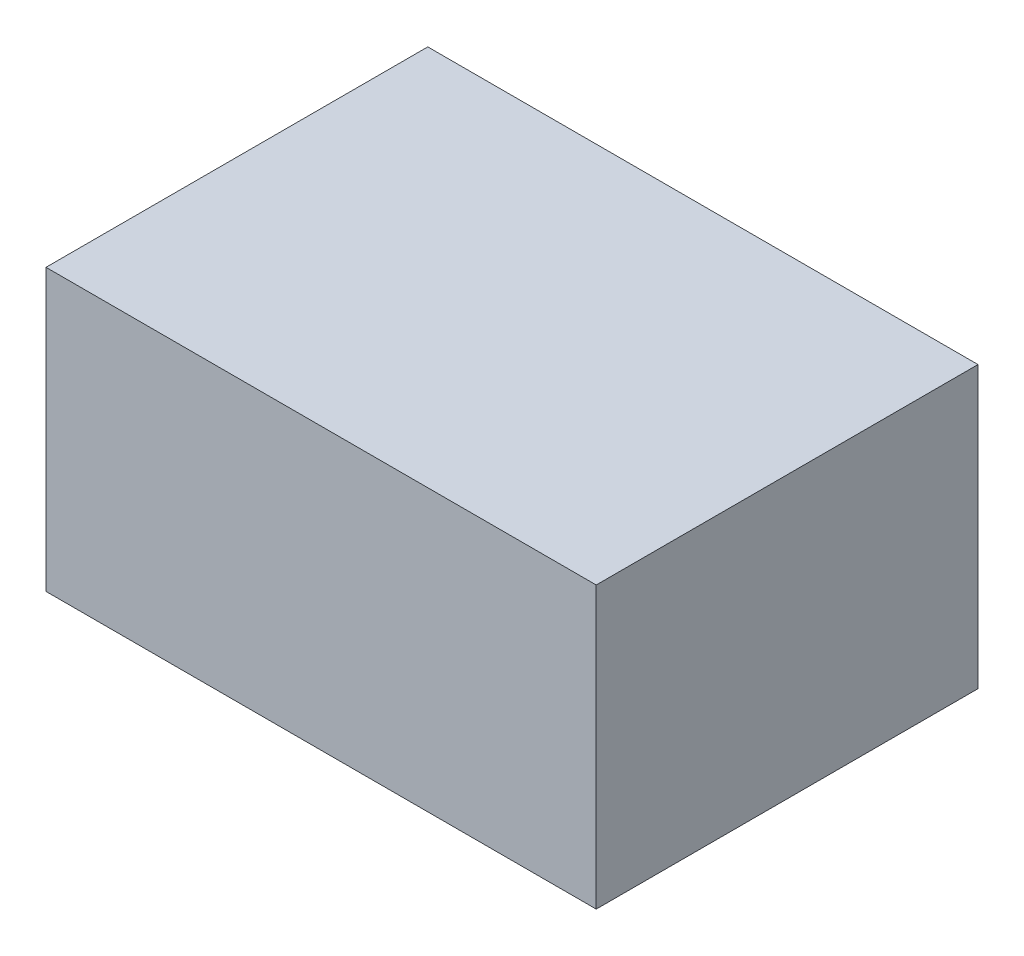
ISO-10303-21;
HEADER;
FILE_DESCRIPTION(('STEP AP214'),'2;1');
FILE_NAME('part.step','',(''),(''),'','','');
FILE_SCHEMA(('AUTOMOTIVE_DESIGN { 1 0 10303 214 1 1 1 1 }'));
ENDSEC;
DATA;
#1=APPLICATION_CONTEXT('core data for automotive mechanical design processes');
#2=APPLICATION_PROTOCOL_DEFINITION('international standard','automotive_design',2000,#1);
#3=PRODUCT_CONTEXT('',#1,'mechanical');
#4=PRODUCT('Part','Part','',(#3));
#5=PRODUCT_RELATED_PRODUCT_CATEGORY('part','',(#4));
#6=PRODUCT_DEFINITION_FORMATION('','',#4);
#7=PRODUCT_DEFINITION_CONTEXT('part definition',#1,'design');
#8=PRODUCT_DEFINITION('design','',#6,#7);
#9=PRODUCT_DEFINITION_SHAPE('','',#8);
#10=(LENGTH_UNIT() NAMED_UNIT(*) SI_UNIT(.MILLI.,.METRE.));
#11=(NAMED_UNIT(*) PLANE_ANGLE_UNIT() SI_UNIT($,.RADIAN.));
#12=(NAMED_UNIT(*) SI_UNIT($,.STERADIAN.) SOLID_ANGLE_UNIT());
#13=UNCERTAINTY_MEASURE_WITH_UNIT(LENGTH_MEASURE(1.E-05),#10,'distance_accuracy_value','');
#14=(GEOMETRIC_REPRESENTATION_CONTEXT(3) GLOBAL_UNCERTAINTY_ASSIGNED_CONTEXT((#13)) GLOBAL_UNIT_ASSIGNED_CONTEXT((#10,
#11,#12)) REPRESENTATION_CONTEXT('',''));
#15=CARTESIAN_POINT('',(0.,0.,0.));
#16=DIRECTION('',(0.,0.,1.));
#17=DIRECTION('',(1.,0.,0.));
#18=AXIS2_PLACEMENT_3D('',#15,#16,#17);
#19=CARTESIAN_POINT('',(-24.5,12.5,34.));
#20=DIRECTION('',(1.,0.,0.));
#21=DIRECTION('',(0.,1.,0.));
#22=AXIS2_PLACEMENT_3D('',#19,#20,#21);
#23=PLANE('',#22);
#24=DIRECTION('',(0.,-1.,0.));
#25=VECTOR('',#24,1.);
#26=CARTESIAN_POINT('',(-24.5,12.5,0.));
#27=LINE('',#26,#25);
#28=CARTESIAN_POINT('',(-24.5,12.5,0.));
#29=VERTEX_POINT('',#28);
#30=CARTESIAN_POINT('',(-24.5,-12.5,0.));
#31=VERTEX_POINT('',#30);
#32=EDGE_CURVE('E96',#29,#31,#27,.T.);
#33=ORIENTED_EDGE('',*,*,#32,.T.);
#34=DIRECTION('',(0.,0.,-1.));
#35=VECTOR('',#34,1.);
#36=CARTESIAN_POINT('',(-24.5,-12.5,34.));
#37=LINE('',#36,#35);
#38=CARTESIAN_POINT('',(-24.5,-12.5,34.));
#39=VERTEX_POINT('',#38);
#40=EDGE_CURVE('E11',#39,#31,#37,.T.);
#41=ORIENTED_EDGE('',*,*,#40,.F.);
#42=DIRECTION('',(0.,-1.,0.));
#43=VECTOR('',#42,1.);
#44=CARTESIAN_POINT('',(-24.5,12.5,34.));
#45=LINE('',#44,#43);
#46=CARTESIAN_POINT('',(-24.5,12.5,34.));
#47=VERTEX_POINT('',#46);
#48=EDGE_CURVE('E84',#47,#39,#45,.T.);
#49=ORIENTED_EDGE('',*,*,#48,.F.);
#50=DIRECTION('',(0.,0.,-1.));
#51=VECTOR('',#50,1.);
#52=CARTESIAN_POINT('',(-24.5,12.5,34.));
#53=LINE('',#52,#51);
#54=EDGE_CURVE('E92',#47,#29,#53,.T.);
#55=ORIENTED_EDGE('',*,*,#54,.T.);
#56=EDGE_LOOP('',(#33,#41,#49,#55));
#57=FACE_BOUND('',#56,.T.);
#58=ADVANCED_FACE('F33',(#57),#23,.F.);
#59=CARTESIAN_POINT('',(24.5,-12.5,34.));
#60=DIRECTION('',(0.,1.,0.));
#61=DIRECTION('',(-1.,0.,0.));
#62=AXIS2_PLACEMENT_3D('',#59,#60,#61);
#63=PLANE('',#62);
#64=DIRECTION('',(1.,0.,0.));
#65=VECTOR('',#64,1.);
#66=CARTESIAN_POINT('',(24.5,-12.5,0.));
#67=LINE('',#66,#65);
#68=CARTESIAN_POINT('',(24.5,-12.5,0.));
#69=VERTEX_POINT('',#68);
#70=EDGE_CURVE('E88',#31,#69,#67,.T.);
#71=ORIENTED_EDGE('',*,*,#70,.T.);
#72=DIRECTION('',(0.,0.,-1.));
#73=VECTOR('',#72,1.);
#74=CARTESIAN_POINT('',(24.5,-12.5,34.));
#75=LINE('',#74,#73);
#76=CARTESIAN_POINT('',(24.5,-12.5,34.));
#77=VERTEX_POINT('',#76);
#78=EDGE_CURVE('E41',#77,#69,#75,.T.);
#79=ORIENTED_EDGE('',*,*,#78,.F.);
#80=DIRECTION('',(1.,0.,0.));
#81=VECTOR('',#80,1.);
#82=CARTESIAN_POINT('',(24.5,-12.5,34.));
#83=LINE('',#82,#81);
#84=EDGE_CURVE('E79',#39,#77,#83,.T.);
#85=ORIENTED_EDGE('',*,*,#84,.F.);
#86=ORIENTED_EDGE('',*,*,#40,.T.);
#87=EDGE_LOOP('',(#71,#79,#85,#86));
#88=FACE_BOUND('',#87,.T.);
#89=ADVANCED_FACE('F87',(#88),#63,.F.);
#90=CARTESIAN_POINT('',(24.5,12.5,34.));
#91=DIRECTION('',(-1.,0.,0.));
#92=DIRECTION('',(0.,-1.,0.));
#93=AXIS2_PLACEMENT_3D('',#90,#91,#92);
#94=PLANE('',#93);
#95=DIRECTION('',(0.,1.,0.));
#96=VECTOR('',#95,1.);
#97=CARTESIAN_POINT('',(24.5,12.5,0.));
#98=LINE('',#97,#96);
#99=CARTESIAN_POINT('',(24.5,12.5,0.));
#100=VERTEX_POINT('',#99);
#101=EDGE_CURVE('E66',#69,#100,#98,.T.);
#102=ORIENTED_EDGE('',*,*,#101,.T.);
#103=DIRECTION('',(0.,0.,-1.));
#104=VECTOR('',#103,1.);
#105=CARTESIAN_POINT('',(24.5,12.5,34.));
#106=LINE('',#105,#104);
#107=CARTESIAN_POINT('',(24.5,12.5,34.));
#108=VERTEX_POINT('',#107);
#109=EDGE_CURVE('E89',#108,#100,#106,.T.);
#110=ORIENTED_EDGE('',*,*,#109,.F.);
#111=DIRECTION('',(0.,1.,0.));
#112=VECTOR('',#111,1.);
#113=CARTESIAN_POINT('',(24.5,12.5,34.));
#114=LINE('',#113,#112);
#115=EDGE_CURVE('E82',#77,#108,#114,.T.);
#116=ORIENTED_EDGE('',*,*,#115,.F.);
#117=ORIENTED_EDGE('',*,*,#78,.T.);
#118=EDGE_LOOP('',(#102,#110,#116,#117));
#119=FACE_BOUND('',#118,.T.);
#120=ADVANCED_FACE('F90',(#119),#94,.F.);
#121=CARTESIAN_POINT('',(24.5,12.5,34.));
#122=DIRECTION('',(0.,-1.,0.));
#123=DIRECTION('',(1.,0.,0.));
#124=AXIS2_PLACEMENT_3D('',#121,#122,#123);
#125=PLANE('',#124);
#126=DIRECTION('',(-1.,0.,0.));
#127=VECTOR('',#126,1.);
#128=CARTESIAN_POINT('',(24.5,12.5,0.));
#129=LINE('',#128,#127);
#130=EDGE_CURVE('E72',#100,#29,#129,.T.);
#131=ORIENTED_EDGE('',*,*,#130,.T.);
#132=ORIENTED_EDGE('',*,*,#54,.F.);
#133=DIRECTION('',(-1.,0.,0.));
#134=VECTOR('',#133,1.);
#135=CARTESIAN_POINT('',(24.5,12.5,34.));
#136=LINE('',#135,#134);
#137=EDGE_CURVE('E49',#108,#47,#136,.T.);
#138=ORIENTED_EDGE('',*,*,#137,.F.);
#139=ORIENTED_EDGE('',*,*,#109,.T.);
#140=EDGE_LOOP('',(#131,#132,#138,#139));
#141=FACE_BOUND('',#140,.T.);
#142=ADVANCED_FACE('F103',(#141),#125,.F.);
#143=CARTESIAN_POINT('',(0.,0.,34.));
#144=DIRECTION('',(0.,0.,-1.));
#145=DIRECTION('',(-1.,0.,0.));
#146=AXIS2_PLACEMENT_3D('',#143,#144,#145);
#147=PLANE('',#146);
#148=ORIENTED_EDGE('',*,*,#48,.T.);
#149=ORIENTED_EDGE('',*,*,#84,.T.);
#150=ORIENTED_EDGE('',*,*,#115,.T.);
#151=ORIENTED_EDGE('',*,*,#137,.T.);
#152=EDGE_LOOP('',(#148,#149,#150,#151));
#153=FACE_BOUND('',#152,.T.);
#154=ADVANCED_FACE('F80',(#153),#147,.F.);
#155=CARTESIAN_POINT('',(0.,0.,0.));
#156=DIRECTION('',(0.,0.,-1.));
#157=DIRECTION('',(-1.,0.,0.));
#158=AXIS2_PLACEMENT_3D('',#155,#156,#157);
#159=PLANE('',#158);
#160=ORIENTED_EDGE('',*,*,#32,.F.);
#161=ORIENTED_EDGE('',*,*,#130,.F.);
#162=ORIENTED_EDGE('',*,*,#101,.F.);
#163=ORIENTED_EDGE('',*,*,#70,.F.);
#164=EDGE_LOOP('',(#160,#161,#162,#163));
#165=FACE_BOUND('',#164,.T.);
#166=ADVANCED_FACE('F106',(#165),#159,.T.);
#167=CLOSED_SHELL('',(#58,#89,#120,#142,#154,#166));
#168=MANIFOLD_SOLID_BREP('B2',#167);
#169=ADVANCED_BREP_SHAPE_REPRESENTATION('',(#18,#168),#14);
#170=SHAPE_DEFINITION_REPRESENTATION(#9,#169);
ENDSEC;
END-ISO-10303-21;
